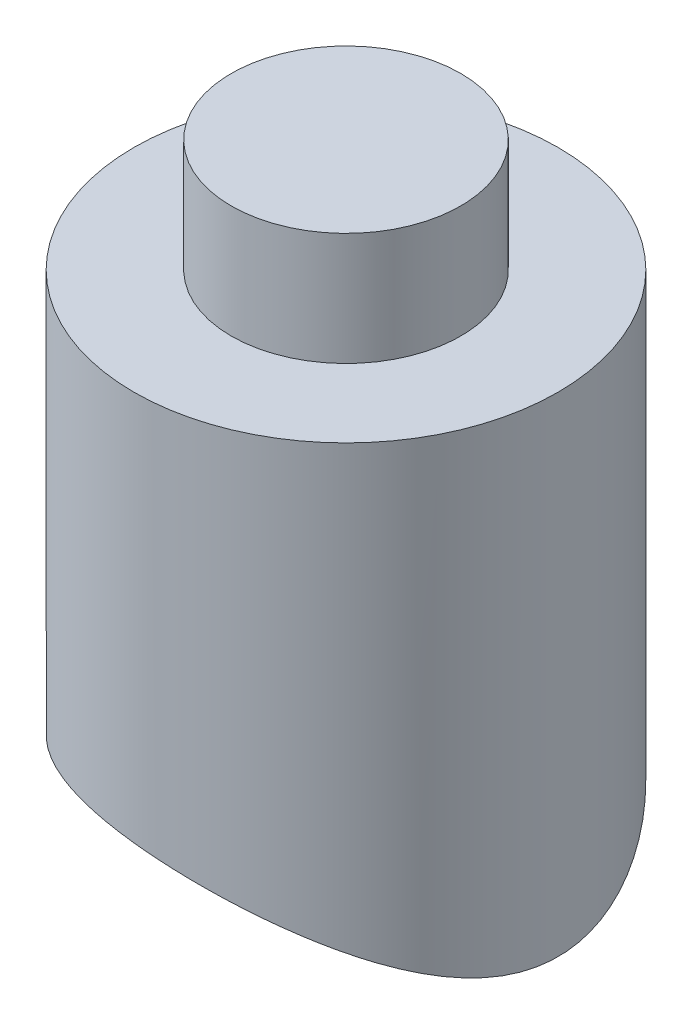
ISO-10303-21;
HEADER;
FILE_DESCRIPTION(('STEP AP214'),'2;1');
FILE_NAME('part.step','',(''),(''),'','','');
FILE_SCHEMA(('AUTOMOTIVE_DESIGN { 1 0 10303 214 1 1 1 1 }'));
ENDSEC;
DATA;
#1=APPLICATION_CONTEXT('core data for automotive mechanical design processes');
#2=APPLICATION_PROTOCOL_DEFINITION('international standard','automotive_design',2000,#1);
#3=PRODUCT_CONTEXT('',#1,'mechanical');
#4=PRODUCT('Part','Part','',(#3));
#5=PRODUCT_RELATED_PRODUCT_CATEGORY('part','',(#4));
#6=PRODUCT_DEFINITION_FORMATION('','',#4);
#7=PRODUCT_DEFINITION_CONTEXT('part definition',#1,'design');
#8=PRODUCT_DEFINITION('design','',#6,#7);
#9=PRODUCT_DEFINITION_SHAPE('','',#8);
#10=(LENGTH_UNIT() NAMED_UNIT(*) SI_UNIT(.MILLI.,.METRE.));
#11=(NAMED_UNIT(*) PLANE_ANGLE_UNIT() SI_UNIT($,.RADIAN.));
#12=(NAMED_UNIT(*) SI_UNIT($,.STERADIAN.) SOLID_ANGLE_UNIT());
#13=UNCERTAINTY_MEASURE_WITH_UNIT(LENGTH_MEASURE(1.E-05),#10,'distance_accuracy_value','');
#14=(GEOMETRIC_REPRESENTATION_CONTEXT(3) GLOBAL_UNCERTAINTY_ASSIGNED_CONTEXT((#13)) GLOBAL_UNIT_ASSIGNED_CONTEXT((#10,
#11,#12)) REPRESENTATION_CONTEXT('',''));
#15=CARTESIAN_POINT('',(0.,0.,0.));
#16=DIRECTION('',(0.,0.,1.));
#17=DIRECTION('',(1.,0.,0.));
#18=AXIS2_PLACEMENT_3D('',#15,#16,#17);
#19=CARTESIAN_POINT('',(0.,-9.144,0.));
#20=DIRECTION('',(0.,1.,0.));
#21=DIRECTION('',(0.,0.,1.));
#22=AXIS2_PLACEMENT_3D('',#19,#20,#21);
#23=CYLINDRICAL_SURFACE('',#22,2.54);
#24=CARTESIAN_POINT('',(0.,0.,0.));
#25=DIRECTION('',(0.,-1.,0.));
#26=DIRECTION('',(0.,0.,-1.));
#27=AXIS2_PLACEMENT_3D('',#24,#25,#26);
#28=CIRCLE('',#27,2.54);
#29=CARTESIAN_POINT('',(0.,0.,-2.54));
#30=VERTEX_POINT('',#29);
#31=EDGE_CURVE('E50',#30,#30,#28,.T.);
#32=ORIENTED_EDGE('',*,*,#31,.T.);
#33=EDGE_LOOP('',(#32));
#34=FACE_BOUND('',#33,.T.);
#35=CARTESIAN_POINT('',(0.,-4.67572466828642,2.54));
#36=CARTESIAN_POINT('',(-0.127537890518359,-4.66049795277359,2.54000150119911));
#37=CARTESIAN_POINT('',(-0.255731948634449,-4.65078041215976,2.53035198013724));
#38=CARTESIAN_POINT('',(-0.509537989759736,-4.64227213801862,2.49167569015591));
#39=CARTESIAN_POINT('',(-0.635149781614719,-4.6434822105177,2.46264749200147));
#40=CARTESIAN_POINT('',(-0.879782982066663,-4.65568154577191,2.38620585221562));
#41=CARTESIAN_POINT('',(-0.998818680169593,-4.66664864155792,2.33883422270034));
#42=CARTESIAN_POINT('',(-1.22764522554221,-4.69637630855169,2.22726460301954));
#43=CARTESIAN_POINT('',(-1.33743325189373,-4.71513924753011,2.16306150295089));
#44=CARTESIAN_POINT('',(-1.55002269061622,-4.75893803210048,2.01653518810406));
#45=CARTESIAN_POINT('',(-1.65231598265262,-4.78421024831269,1.9335479292957));
#46=CARTESIAN_POINT('',(-1.84256086203974,-4.83750780059923,1.75321702936502));
#47=CARTESIAN_POINT('',(-1.93050423261117,-4.86553469939388,1.65586522341414));
#48=CARTESIAN_POINT('',(-2.09824406229183,-4.92382241835782,1.43860527194251));
#49=CARTESIAN_POINT('',(-2.17641742482091,-4.95403553848893,1.31742436534192));
#50=CARTESIAN_POINT('',(-2.31151321192455,-5.00955065762835,1.062676179378));
#51=CARTESIAN_POINT('',(-2.36843815446718,-5.03485323837187,0.92911036998661));
#52=CARTESIAN_POINT('',(-2.45850345751699,-5.07626870693235,0.654252249353283));
#53=CARTESIAN_POINT('',(-2.49187492426729,-5.09247055990906,0.513050079290032));
#54=CARTESIAN_POINT('',(-2.53404379638144,-5.11311774015265,0.226234094648902));
#55=CARTESIAN_POINT('',(-2.54286419993969,-5.11757406982388,0.0806245380579236));
#56=CARTESIAN_POINT('',(-2.53585755922723,-5.11409358306563,-0.195443374419476));
#57=CARTESIAN_POINT('',(-2.52236860594273,-5.10733219185903,-0.3259838033446));
#58=CARTESIAN_POINT('',(-2.47570519413478,-5.08467581806516,-0.582673608425292));
#59=CARTESIAN_POINT('',(-2.44252562510089,-5.06877846436038,-0.708821835625454));
#60=CARTESIAN_POINT('',(-2.3576620958999,-5.03009361908858,-0.953886199001924));
#61=CARTESIAN_POINT('',(-2.30593446472245,-5.00728988645708,-1.07278448571992));
#62=CARTESIAN_POINT('',(-2.18547746022138,-4.95772788615213,-1.30074009454583));
#63=CARTESIAN_POINT('',(-2.1167406718645,-4.93096789582701,-1.40979309629063));
#64=CARTESIAN_POINT('',(-1.95601631314234,-4.87385542362884,-1.6265230725884));
#65=CARTESIAN_POINT('',(-1.86238756510514,-4.84341193975004,-1.73296341765267));
#66=CARTESIAN_POINT('',(-1.6582176389003,-4.7855557803962,-1.92924069975831));
#67=CARTESIAN_POINT('',(-1.54767175999758,-4.75814395098029,-2.01907300658466));
#68=CARTESIAN_POINT('',(-1.30955927169246,-4.70974482343757,-2.18124112586457));
#69=CARTESIAN_POINT('',(-1.18168723525772,-4.68890254184135,-2.25317547426926));
#70=CARTESIAN_POINT('',(-0.914374631587371,-4.65814559891905,-2.37423468034953));
#71=CARTESIAN_POINT('',(-0.774945077069491,-4.64822066070869,-2.42338096398333));
#72=CARTESIAN_POINT('',(-0.502883717179521,-4.64224382352607,-2.49329927134219));
#73=CARTESIAN_POINT('',(-0.370853332025801,-4.64497037296804,-2.5163124718662));
#74=CARTESIAN_POINT('',(-0.105621324687606,-4.66241071712508,-2.54129288159801));
#75=CARTESIAN_POINT('',(0.0275799292753676,-4.6771208678131,-2.54326648605078));
#76=CARTESIAN_POINT('',(0.282688396326351,-4.71685045722337,-2.52725583609548));
#77=CARTESIAN_POINT('',(0.404785520699257,-4.74117817033081,-2.51049488716223));
#78=CARTESIAN_POINT('',(0.643236635162651,-4.79882050057803,-2.46022433297994));
#79=CARTESIAN_POINT('',(0.759589573418468,-4.8321367564685,-2.42671167268322));
#80=CARTESIAN_POINT('',(0.991550068439381,-4.90839141964414,-2.34193279594414));
#81=CARTESIAN_POINT('',(1.10663021038138,-4.95181025021166,-2.2896649313996));
#82=CARTESIAN_POINT('',(1.32607820782683,-5.04442028467069,-2.16996843671421));
#83=CARTESIAN_POINT('',(1.4304392293592,-5.0936151287537,-2.10253022104514));
#84=CARTESIAN_POINT('',(1.64196170604339,-5.2026840187944,-1.94309587851314));
#85=CARTESIAN_POINT('',(1.74723763948225,-5.26305907051738,-1.84894006771224));
#86=CARTESIAN_POINT('',(1.94096216974697,-5.38360748464844,-1.64442252222805));
#87=CARTESIAN_POINT('',(2.0294003911498,-5.44378070039713,-1.53405086904569));
#88=CARTESIAN_POINT('',(2.17981620188476,-5.55287199583674,-1.31008352126063));
#89=CARTESIAN_POINT('',(2.24356279784825,-5.60231315781895,-1.19793533119023));
#90=CARTESIAN_POINT('',(2.35426049336497,-5.69197231165825,-0.962254750607103));
#91=CARTESIAN_POINT('',(2.40124122468226,-5.73220653012017,-0.838742935035595));
#92=CARTESIAN_POINT('',(2.46841866145345,-5.79128785642265,-0.60816535362995));
#93=CARTESIAN_POINT('',(2.49210888831552,-5.81281354217209,-0.502817904760754));
#94=CARTESIAN_POINT('',(2.52591655848757,-5.84382918842033,-0.288270392215265));
#95=CARTESIAN_POINT('',(2.53605063305685,-5.85333389597965,-0.179075218292238));
#96=CARTESIAN_POINT('',(2.54205505381218,-5.85894301584815,0.0403572087932514));
#97=CARTESIAN_POINT('',(2.53788791972962,-5.85501221680934,0.150596443947309));
#98=CARTESIAN_POINT('',(2.51552786566295,-5.83427891657323,0.368430484970364));
#99=CARTESIAN_POINT('',(2.49732159116892,-5.8174641598118,0.476022672263938));
#100=CARTESIAN_POINT('',(2.44319860403118,-5.76888384463965,0.706392721036215));
#101=CARTESIAN_POINT('',(2.40451549265535,-5.73483818224737,0.828027545869901));
#102=CARTESIAN_POINT('',(2.31103449129748,-5.65646488222323,1.06141379875842));
#103=CARTESIAN_POINT('',(2.25620518218274,-5.61211723366257,1.17314539926436));
#104=CARTESIAN_POINT('',(2.11654814754736,-5.5056917915405,1.41266278266565));
#105=CARTESIAN_POINT('',(2.02763908064462,-5.44196971421837,1.53733452165251));
#106=CARTESIAN_POINT('',(1.82967990744534,-5.31256811815912,1.76834093747576));
#107=CARTESIAN_POINT('',(1.7206159635892,-5.24688728075315,1.87466291849694));
#108=CARTESIAN_POINT('',(1.48318126535002,-5.11886556042171,2.06768206906378));
#109=CARTESIAN_POINT('',(1.35469523782505,-5.05654785524023,2.15425375378265));
#110=CARTESIAN_POINT('',(1.08103146338301,-4.94095716628635,2.30373185612054));
#111=CARTESIAN_POINT('',(0.935880710308069,-4.88766989212915,2.36667585933489));
#112=CARTESIAN_POINT('',(0.66006846161143,-4.80320355373326,2.45620541105542));
#113=CARTESIAN_POINT('',(0.53156964450601,-4.76976646932301,2.48732034275086));
#114=CARTESIAN_POINT('',(0.26895519241472,-4.71408121217085,2.52920834334421));
#115=CARTESIAN_POINT('',(0.134844347640148,-4.69182369981098,2.53999841279941));
#116=CARTESIAN_POINT('',(0.,-4.67572466828642,2.54));
#117=B_SPLINE_CURVE_WITH_KNOTS('',3,(#35,#36,#37,#38,#39,#40,#41,#42,#43,#44,#45,#46,#47,#48,
#49,#50,#51,#52,#53,#54,#55,#56,#57,#58,#59,#60,#61,#62,#63,#64,#65,#66,#67,#68,#69,#70,#71,#72,
#73,#74,#75,#76,#77,#78,#79,#80,#81,#82,#83,#84,#85,#86,#87,#88,#89,#90,#91,#92,#93,#94,#95,#96,
#97,#98,#99,#100,#101,#102,#103,#104,#105,#106,#107,#108,#109,#110,#111,#112,#113,#114,#115,
#116),.UNSPECIFIED.,.T.,.F.,(4,2,2,2,2,2,2,2,2,2,2,2,2,2,2,2,2,2,2,2,2,2,2,2,2,2,2,2,2,2,2,2,2,
2,2,2,2,2,2,2,4),(0.,0.384835850150384,0.769700086223493,1.15369217625467,1.53780097856156,
1.93853609029052,2.33949986417671,2.77944274726946,3.21933347994021,3.65484564207196,
4.08994970091521,4.48227396427934,4.87470009620134,5.26805632018536,5.66158432833632,
6.09460909815897,6.52775441106877,6.96988204756954,7.41159313646544,7.81159265899728,
8.2114705932684,8.58668784622162,8.96197355337797,9.36135251696571,9.76098454426369,
10.2199617967661,10.6792209627985,11.0921674370832,11.5043804179804,11.8333184554526,
12.1618525666143,12.4912483489813,12.8209578509767,13.21512109176,13.6100564670931,
14.1051435116283,14.6005717352025,15.0990650838211,15.5967620624041,16.0039853592039,
16.4108678860449),.UNSPECIFIED.);
#118=CARTESIAN_POINT('',(0.,-4.67572466828642,2.54));
#119=VERTEX_POINT('',#118);
#120=EDGE_CURVE('E36',#119,#119,#117,.T.);
#121=ORIENTED_EDGE('',*,*,#120,.F.);
#122=EDGE_LOOP('',(#121));
#123=FACE_BOUND('',#122,.T.);
#124=ADVANCED_FACE('F32',(#34,#123),#23,.T.);
#125=CARTESIAN_POINT('',(0.,1.35,0.));
#126=DIRECTION('',(0.,-1.,0.));
#127=DIRECTION('',(0.,0.,-1.));
#128=AXIS2_PLACEMENT_3D('',#125,#126,#127);
#129=CYLINDRICAL_SURFACE('',#128,1.375);
#130=CARTESIAN_POINT('',(0.,1.35,0.));
#131=DIRECTION('',(0.,1.,0.));
#132=DIRECTION('',(0.,0.,1.));
#133=AXIS2_PLACEMENT_3D('',#130,#131,#132);
#134=CIRCLE('',#133,1.375);
#135=CARTESIAN_POINT('',(0.,1.35,-1.375));
#136=VERTEX_POINT('',#135);
#137=EDGE_CURVE('E10',#136,#136,#134,.T.);
#138=CARTESIAN_POINT('',(0.,0.,0.));
#139=DIRECTION('',(0.,1.,0.));
#140=DIRECTION('',(0.,0.,1.));
#141=AXIS2_PLACEMENT_3D('',#138,#139,#140);
#142=CIRCLE('',#141,1.375);
#143=CARTESIAN_POINT('',(0.,0.,-1.375));
#144=VERTEX_POINT('',#143);
#145=EDGE_CURVE('E45',#144,#144,#142,.T.);
#146=CARTESIAN_POINT('',(0.,1.35,-1.375));
#147=CARTESIAN_POINT('',(0.,1.3359375,-1.375));
#148=CARTESIAN_POINT('',(0.,1.321875,-1.375));
#149=CARTESIAN_POINT('',(0.,1.29375,-1.375));
#150=CARTESIAN_POINT('',(0.,1.2796875,-1.375));
#151=CARTESIAN_POINT('',(0.,1.2515625,-1.375));
#152=CARTESIAN_POINT('',(0.,1.2375,-1.375));
#153=CARTESIAN_POINT('',(0.,1.209375,-1.375));
#154=CARTESIAN_POINT('',(0.,1.1953125,-1.375));
#155=CARTESIAN_POINT('',(0.,1.1671875,-1.375));
#156=CARTESIAN_POINT('',(0.,1.153125,-1.375));
#157=CARTESIAN_POINT('',(0.,1.125,-1.375));
#158=CARTESIAN_POINT('',(0.,1.1109375,-1.375));
#159=CARTESIAN_POINT('',(0.,1.0828125,-1.375));
#160=CARTESIAN_POINT('',(0.,1.06875,-1.375));
#161=CARTESIAN_POINT('',(0.,1.040625,-1.375));
#162=CARTESIAN_POINT('',(0.,1.0265625,-1.375));
#163=CARTESIAN_POINT('',(0.,0.9984375,-1.375));
#164=CARTESIAN_POINT('',(0.,0.984375,-1.375));
#165=CARTESIAN_POINT('',(0.,0.95625,-1.375));
#166=CARTESIAN_POINT('',(0.,0.9421875,-1.375));
#167=CARTESIAN_POINT('',(0.,0.9140625,-1.375));
#168=CARTESIAN_POINT('',(0.,0.9,-1.375));
#169=CARTESIAN_POINT('',(0.,0.871875,-1.375));
#170=CARTESIAN_POINT('',(0.,0.8578125,-1.375));
#171=CARTESIAN_POINT('',(0.,0.8296875,-1.375));
#172=CARTESIAN_POINT('',(0.,0.815625,-1.375));
#173=CARTESIAN_POINT('',(0.,0.7875,-1.375));
#174=CARTESIAN_POINT('',(0.,0.7734375,-1.375));
#175=CARTESIAN_POINT('',(0.,0.7453125,-1.375));
#176=CARTESIAN_POINT('',(0.,0.73125,-1.375));
#177=CARTESIAN_POINT('',(0.,0.703125,-1.375));
#178=CARTESIAN_POINT('',(0.,0.6890625,-1.375));
#179=CARTESIAN_POINT('',(0.,0.6609375,-1.375));
#180=CARTESIAN_POINT('',(0.,0.646875,-1.375));
#181=CARTESIAN_POINT('',(0.,0.61875,-1.375));
#182=CARTESIAN_POINT('',(0.,0.6046875,-1.375));
#183=CARTESIAN_POINT('',(0.,0.5765625,-1.375));
#184=CARTESIAN_POINT('',(0.,0.5625,-1.375));
#185=CARTESIAN_POINT('',(0.,0.534375,-1.375));
#186=CARTESIAN_POINT('',(0.,0.5203125,-1.375));
#187=CARTESIAN_POINT('',(0.,0.4921875,-1.375));
#188=CARTESIAN_POINT('',(0.,0.478125,-1.375));
#189=CARTESIAN_POINT('',(0.,0.45,-1.375));
#190=CARTESIAN_POINT('',(0.,0.4359375,-1.375));
#191=CARTESIAN_POINT('',(0.,0.4078125,-1.375));
#192=CARTESIAN_POINT('',(0.,0.39375,-1.375));
#193=CARTESIAN_POINT('',(0.,0.365625,-1.375));
#194=CARTESIAN_POINT('',(0.,0.3515625,-1.375));
#195=CARTESIAN_POINT('',(0.,0.3234375,-1.375));
#196=CARTESIAN_POINT('',(0.,0.309375,-1.375));
#197=CARTESIAN_POINT('',(0.,0.28125,-1.375));
#198=CARTESIAN_POINT('',(0.,0.2671875,-1.375));
#199=CARTESIAN_POINT('',(0.,0.2390625,-1.375));
#200=CARTESIAN_POINT('',(0.,0.225,-1.375));
#201=CARTESIAN_POINT('',(0.,0.196875,-1.375));
#202=CARTESIAN_POINT('',(0.,0.1828125,-1.375));
#203=CARTESIAN_POINT('',(0.,0.1546875,-1.375));
#204=CARTESIAN_POINT('',(0.,0.140625,-1.375));
#205=CARTESIAN_POINT('',(0.,0.1125,-1.375));
#206=CARTESIAN_POINT('',(0.,0.0984374999999998,-1.375));
#207=CARTESIAN_POINT('',(0.,0.0703124999999998,-1.375));
#208=CARTESIAN_POINT('',(0.,0.0562499999999999,-1.375));
#209=CARTESIAN_POINT('',(0.,0.0281249999999999,-1.375));
#210=CARTESIAN_POINT('',(0.,0.0140624999999998,-1.375));
#211=CARTESIAN_POINT('',(0.,0.,-1.375));
#212=B_SPLINE_CURVE_WITH_KNOTS('',3,(#146,#147,#148,#149,#150,#151,#152,#153,#154,#155,#156,
#157,#158,#159,#160,#161,#162,#163,#164,#165,#166,#167,#168,#169,#170,#171,#172,#173,#174,#175,
#176,#177,#178,#179,#180,#181,#182,#183,#184,#185,#186,#187,#188,#189,#190,#191,#192,#193,#194,
#195,#196,#197,#198,#199,#200,#201,#202,#203,#204,#205,#206,#207,#208,#209,#210,#211),
.UNSPECIFIED.,.F.,.F.,(4,2,2,2,2,2,2,2,2,2,2,2,2,2,2,2,2,2,2,2,2,2,2,2,2,2,2,2,2,2,2,2,4),(0.,
0.0421875000000001,0.084375,0.1265625,0.16875,0.2109375,0.253125,0.2953125,0.3375,0.3796875,
0.421875,0.4640625,0.50625,0.5484375,0.590625,0.6328125,0.675,0.7171875,0.759375,0.8015625,
0.84375,0.8859375,0.928125,0.9703125,1.0125,1.0546875,1.096875,1.1390625,1.18125,1.2234375,
1.265625,1.3078125,1.35),.UNSPECIFIED.);
#213=EDGE_CURVE('BSEAM34',#136,#144,#212,.T.);
#214=ORIENTED_EDGE('',*,*,#137,.F.);
#215=ORIENTED_EDGE('',*,*,#145,.T.);
#216=ORIENTED_EDGE('',*,*,#213,.T.);
#217=ORIENTED_EDGE('',*,*,#213,.F.);
#218=EDGE_LOOP('',(#214,#216,#215,#217));
#219=FACE_BOUND('',#218,.T.);
#220=ADVANCED_FACE('F34',(#219),#129,.T.);
#221=CARTESIAN_POINT('',(0.,1.35,0.));
#222=DIRECTION('',(0.,1.,0.));
#223=DIRECTION('',(0.,0.,1.));
#224=AXIS2_PLACEMENT_3D('',#221,#222,#223);
#225=PLANE('',#224);
#226=ORIENTED_EDGE('',*,*,#137,.T.);
#227=EDGE_LOOP('',(#226));
#228=FACE_BOUND('',#227,.T.);
#229=ADVANCED_FACE('F64',(#228),#225,.T.);
#230=CARTESIAN_POINT('',(0.,0.,0.));
#231=DIRECTION('',(0.,-1.,0.));
#232=DIRECTION('',(0.,0.,-1.));
#233=AXIS2_PLACEMENT_3D('',#230,#231,#232);
#234=PLANE('',#233);
#235=ORIENTED_EDGE('',*,*,#145,.F.);
#236=EDGE_LOOP('',(#235));
#237=FACE_BOUND('',#236,.T.);
#238=ORIENTED_EDGE('',*,*,#31,.F.);
#239=EDGE_LOOP('',(#238));
#240=FACE_BOUND('',#239,.T.);
#241=ADVANCED_FACE('F68',(#237,#240),#234,.F.);
#242=CARTESIAN_POINT('',(-0.533399999999999,-9.144,3.81));
#243=DIRECTION('',(0.,0.,-1.));
#244=DIRECTION('',(-1.,0.,0.));
#245=AXIS2_PLACEMENT_3D('',#242,#243,#244);
#246=CYLINDRICAL_SURFACE('',#245,4.5);
#247=ORIENTED_EDGE('',*,*,#120,.T.);
#248=EDGE_LOOP('',(#247));
#249=FACE_BOUND('',#248,.T.);
#250=ADVANCED_FACE('F58',(#249),#246,.F.);
#251=CLOSED_SHELL('',(#124,#220,#229,#241,#250));
#252=MANIFOLD_SOLID_BREP('B2',#251);
#253=ADVANCED_BREP_SHAPE_REPRESENTATION('',(#18,#252),#14);
#254=SHAPE_DEFINITION_REPRESENTATION(#9,#253);
ENDSEC;
END-ISO-10303-21;
